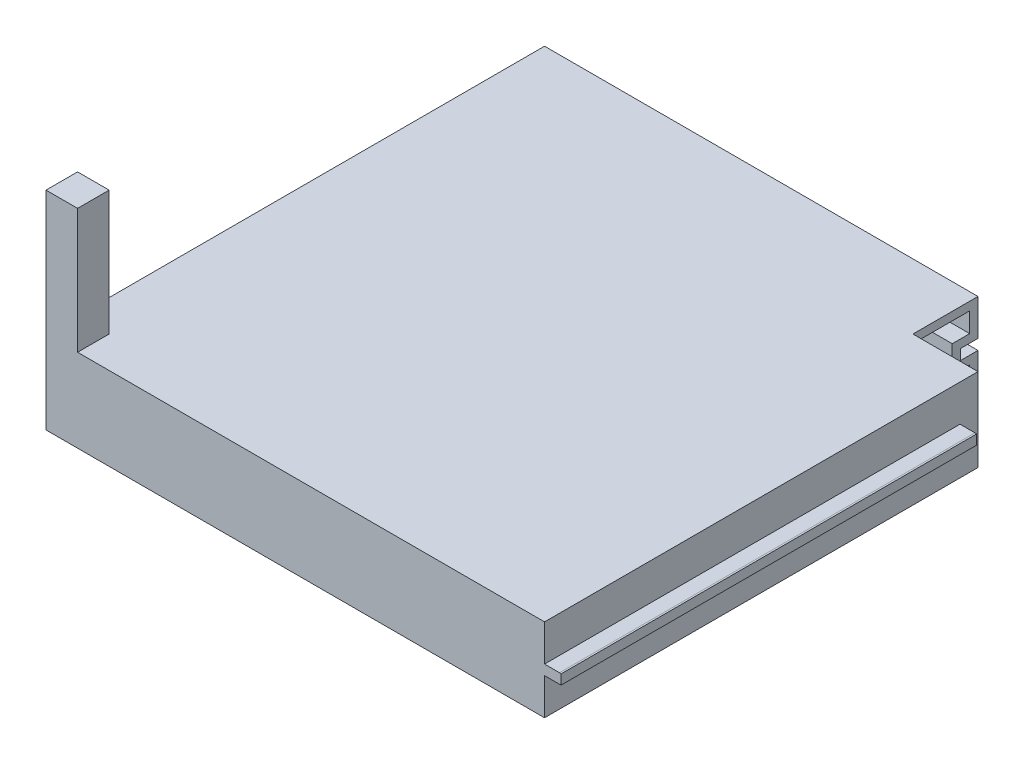
ISO-10303-21;
HEADER;
FILE_DESCRIPTION(('STEP AP214'),'2;1');
FILE_NAME('part.step','',(''),(''),'','','');
FILE_SCHEMA(('AUTOMOTIVE_DESIGN { 1 0 10303 214 1 1 1 1 }'));
ENDSEC;
DATA;
#1=APPLICATION_CONTEXT('core data for automotive mechanical design processes');
#2=APPLICATION_PROTOCOL_DEFINITION('international standard','automotive_design',2000,#1);
#3=PRODUCT_CONTEXT('',#1,'mechanical');
#4=PRODUCT('Part','Part','',(#3));
#5=PRODUCT_RELATED_PRODUCT_CATEGORY('part','',(#4));
#6=PRODUCT_DEFINITION_FORMATION('','',#4);
#7=PRODUCT_DEFINITION_CONTEXT('part definition',#1,'design');
#8=PRODUCT_DEFINITION('design','',#6,#7);
#9=PRODUCT_DEFINITION_SHAPE('','',#8);
#10=(LENGTH_UNIT() NAMED_UNIT(*) SI_UNIT(.MILLI.,.METRE.));
#11=(NAMED_UNIT(*) PLANE_ANGLE_UNIT() SI_UNIT($,.RADIAN.));
#12=(NAMED_UNIT(*) SI_UNIT($,.STERADIAN.) SOLID_ANGLE_UNIT());
#13=UNCERTAINTY_MEASURE_WITH_UNIT(LENGTH_MEASURE(1.E-05),#10,'distance_accuracy_value','');
#14=(GEOMETRIC_REPRESENTATION_CONTEXT(3) GLOBAL_UNCERTAINTY_ASSIGNED_CONTEXT((#13)) GLOBAL_UNIT_ASSIGNED_CONTEXT((#10,
#11,#12)) REPRESENTATION_CONTEXT('',''));
#15=CARTESIAN_POINT('',(0.,0.,0.));
#16=DIRECTION('',(0.,0.,1.));
#17=DIRECTION('',(1.,0.,0.));
#18=AXIS2_PLACEMENT_3D('',#15,#16,#17);
#19=CARTESIAN_POINT('',(-22.3212121212121,25.4,-15.875));
#20=DIRECTION('',(0.,0.,1.));
#21=DIRECTION('',(1.,0.,0.));
#22=AXIS2_PLACEMENT_3D('',#19,#20,#21);
#23=PLANE('',#22);
#24=DIRECTION('',(-1.,0.,0.));
#25=VECTOR('',#24,1.);
#26=CARTESIAN_POINT('',(-22.3212121212121,25.4,-15.875));
#27=LINE('',#26,#25);
#28=CARTESIAN_POINT('',(110.178787878788,25.4,-15.875));
#29=VERTEX_POINT('',#28);
#30=CARTESIAN_POINT('',(-22.3212121212121,25.4,-15.875));
#31=VERTEX_POINT('',#30);
#32=EDGE_CURVE('E292',#29,#31,#27,.T.);
#33=ORIENTED_EDGE('',*,*,#32,.F.);
#34=DIRECTION('',(0.,-1.,0.));
#35=VECTOR('',#34,1.);
#36=CARTESIAN_POINT('',(110.178787878788,25.4,-15.875));
#37=LINE('',#36,#35);
#38=CARTESIAN_POINT('',(110.178787878788,14.2875,-15.875));
#39=VERTEX_POINT('',#38);
#40=EDGE_CURVE('E755',#29,#39,#37,.T.);
#41=ORIENTED_EDGE('',*,*,#40,.T.);
#42=DIRECTION('',(-1.,0.,0.));
#43=VECTOR('',#42,1.);
#44=CARTESIAN_POINT('',(127.538787878788,14.2875,-15.875));
#45=LINE('',#44,#43);
#46=CARTESIAN_POINT('',(-22.3212121212121,14.2875,-15.875));
#47=VERTEX_POINT('',#46);
#48=EDGE_CURVE('E585',#39,#47,#45,.T.);
#49=ORIENTED_EDGE('',*,*,#48,.T.);
#50=DIRECTION('',(0.,-1.,0.));
#51=VECTOR('',#50,1.);
#52=CARTESIAN_POINT('',(-22.3212121212121,25.4,-15.875));
#53=LINE('',#52,#51);
#54=EDGE_CURVE('E316',#31,#47,#53,.T.);
#55=ORIENTED_EDGE('',*,*,#54,.F.);
#56=EDGE_LOOP('',(#33,#41,#49,#55));
#57=FACE_BOUND('',#56,.T.);
#58=ADVANCED_FACE('F47',(#57),#23,.F.);
#59=CARTESIAN_POINT('',(130.078787878788,25.4,-15.875));
#60=DIRECTION('',(-1.,0.,0.));
#61=DIRECTION('',(0.,0.,1.));
#62=AXIS2_PLACEMENT_3D('',#59,#60,#61);
#63=PLANE('',#62);
#64=DIRECTION('',(0.,0.,-1.));
#65=VECTOR('',#64,1.);
#66=CARTESIAN_POINT('',(130.078787878788,0.,-15.875));
#67=LINE('',#66,#65);
#68=CARTESIAN_POINT('',(130.078787878788,0.,136.525));
#69=VERTEX_POINT('',#68);
#70=CARTESIAN_POINT('',(130.078787878788,0.,4.02499999999999));
#71=VERTEX_POINT('',#70);
#72=EDGE_CURVE('E283',#69,#71,#67,.T.);
#73=ORIENTED_EDGE('',*,*,#72,.T.);
#74=DIRECTION('',(0.,-1.,0.));
#75=VECTOR('',#74,1.);
#76=CARTESIAN_POINT('',(130.078787878788,25.4,4.02499999999999));
#77=LINE('',#76,#75);
#78=CARTESIAN_POINT('',(130.078787878788,25.4,4.02499999999999));
#79=VERTEX_POINT('',#78);
#80=EDGE_CURVE('E264',#79,#71,#77,.T.);
#81=ORIENTED_EDGE('',*,*,#80,.F.);
#82=DIRECTION('',(0.,0.,-1.));
#83=VECTOR('',#82,1.);
#84=CARTESIAN_POINT('',(130.078787878788,25.4,-15.875));
#85=LINE('',#84,#83);
#86=CARTESIAN_POINT('',(130.078787878788,25.4,136.525));
#87=VERTEX_POINT('',#86);
#88=EDGE_CURVE('E281',#87,#79,#85,.T.);
#89=ORIENTED_EDGE('',*,*,#88,.F.);
#90=DIRECTION('',(0.,-1.,0.));
#91=VECTOR('',#90,1.);
#92=CARTESIAN_POINT('',(130.078787878788,25.4,136.525));
#93=LINE('',#92,#91);
#94=CARTESIAN_POINT('',(130.078787878788,14.224,136.525));
#95=VERTEX_POINT('',#94);
#96=EDGE_CURVE('E321',#87,#95,#93,.T.);
#97=ORIENTED_EDGE('',*,*,#96,.T.);
#98=DIRECTION('',(0.,0.,1.));
#99=VECTOR('',#98,1.);
#100=CARTESIAN_POINT('',(130.078787878788,14.224,9.52500000000001));
#101=LINE('',#100,#99);
#102=CARTESIAN_POINT('',(130.078787878788,14.224,9.52500000000001));
#103=VERTEX_POINT('',#102);
#104=EDGE_CURVE('E617',#103,#95,#101,.T.);
#105=ORIENTED_EDGE('',*,*,#104,.F.);
#106=DIRECTION('',(0.,-1.,0.));
#107=VECTOR('',#106,1.);
#108=CARTESIAN_POINT('',(130.078787878788,14.224,9.52500000000001));
#109=LINE('',#108,#107);
#110=CARTESIAN_POINT('',(130.078787878788,11.176,9.52500000000001));
#111=VERTEX_POINT('',#110);
#112=EDGE_CURVE('E593',#103,#111,#109,.T.);
#113=ORIENTED_EDGE('',*,*,#112,.T.);
#114=DIRECTION('',(0.,0.,1.));
#115=VECTOR('',#114,1.);
#116=CARTESIAN_POINT('',(130.078787878788,11.176,9.52500000000001));
#117=LINE('',#116,#115);
#118=CARTESIAN_POINT('',(130.078787878788,11.176,136.525));
#119=VERTEX_POINT('',#118);
#120=EDGE_CURVE('E608',#111,#119,#117,.T.);
#121=ORIENTED_EDGE('',*,*,#120,.T.);
#122=EDGE_CURVE('E320',#119,#69,#93,.T.);
#123=ORIENTED_EDGE('',*,*,#122,.T.);
#124=EDGE_LOOP('',(#73,#81,#89,#97,#105,#113,#121,#123));
#125=FACE_BOUND('',#124,.T.);
#126=ADVANCED_FACE('F279',(#125),#63,.F.);
#127=CARTESIAN_POINT('',(-22.3212121212121,25.4,-15.875));
#128=DIRECTION('',(1.,0.,0.));
#129=DIRECTION('',(0.,0.,-1.));
#130=AXIS2_PLACEMENT_3D('',#127,#128,#129);
#131=PLANE('',#130);
#132=DIRECTION('',(0.,-1.,0.));
#133=VECTOR('',#132,1.);
#134=CARTESIAN_POINT('',(-22.3212121212121,14.2875,-10.541));
#135=LINE('',#134,#133);
#136=CARTESIAN_POINT('',(-22.3212121212121,14.2875,-10.541));
#137=VERTEX_POINT('',#136);
#138=CARTESIAN_POINT('',(-22.3212121212121,11.1125,-10.541));
#139=VERTEX_POINT('',#138);
#140=EDGE_CURVE('E572',#137,#139,#135,.T.);
#141=ORIENTED_EDGE('',*,*,#140,.T.);
#142=DIRECTION('',(0.,0.,1.));
#143=VECTOR('',#142,1.);
#144=CARTESIAN_POINT('',(-22.3212121212121,11.1125,-15.875));
#145=LINE('',#144,#143);
#146=CARTESIAN_POINT('',(-22.3212121212121,11.1125,-15.875));
#147=VERTEX_POINT('',#146);
#148=EDGE_CURVE('E565',#147,#139,#145,.T.);
#149=ORIENTED_EDGE('',*,*,#148,.F.);
#150=CARTESIAN_POINT('',(-22.3212121212121,0.,-15.875));
#151=VERTEX_POINT('',#150);
#152=EDGE_CURVE('E296',#147,#151,#53,.T.);
#153=ORIENTED_EDGE('',*,*,#152,.T.);
#154=DIRECTION('',(0.,0.,1.));
#155=VECTOR('',#154,1.);
#156=CARTESIAN_POINT('',(-22.3212121212121,0.,-15.875));
#157=LINE('',#156,#155);
#158=CARTESIAN_POINT('',(-22.3212121212121,0.,136.525));
#159=VERTEX_POINT('',#158);
#160=EDGE_CURVE('E302',#151,#159,#157,.T.);
#161=ORIENTED_EDGE('',*,*,#160,.T.);
#162=DIRECTION('',(0.,-1.,0.));
#163=VECTOR('',#162,1.);
#164=CARTESIAN_POINT('',(-22.3212121212121,25.4,136.525));
#165=LINE('',#164,#163);
#166=CARTESIAN_POINT('',(-22.3212121212121,63.5,136.525));
#167=VERTEX_POINT('',#166);
#168=EDGE_CURVE('E324',#167,#159,#165,.T.);
#169=ORIENTED_EDGE('',*,*,#168,.F.);
#170=DIRECTION('',(0.,0.,1.));
#171=VECTOR('',#170,1.);
#172=CARTESIAN_POINT('',(-22.3212121212121,63.5,136.525));
#173=LINE('',#172,#171);
#174=CARTESIAN_POINT('',(-22.3212121212121,63.5,126.873));
#175=VERTEX_POINT('',#174);
#176=EDGE_CURVE('E625',#175,#167,#173,.T.);
#177=ORIENTED_EDGE('',*,*,#176,.F.);
#178=DIRECTION('',(0.,-1.,0.));
#179=VECTOR('',#178,1.);
#180=CARTESIAN_POINT('',(-22.3212121212121,63.5,126.873));
#181=LINE('',#180,#179);
#182=CARTESIAN_POINT('',(-22.3212121212121,25.4,126.873));
#183=VERTEX_POINT('',#182);
#184=EDGE_CURVE('E639',#175,#183,#181,.T.);
#185=ORIENTED_EDGE('',*,*,#184,.T.);
#186=DIRECTION('',(0.,0.,1.));
#187=VECTOR('',#186,1.);
#188=CARTESIAN_POINT('',(-22.3212121212121,25.4,-15.875));
#189=LINE('',#188,#187);
#190=EDGE_CURVE('E298',#31,#183,#189,.T.);
#191=ORIENTED_EDGE('',*,*,#190,.F.);
#192=ORIENTED_EDGE('',*,*,#54,.T.);
#193=DIRECTION('',(0.,0.,1.));
#194=VECTOR('',#193,1.);
#195=CARTESIAN_POINT('',(-22.3212121212121,14.2875,-15.875));
#196=LINE('',#195,#194);
#197=EDGE_CURVE('E576',#47,#137,#196,.T.);
#198=ORIENTED_EDGE('',*,*,#197,.T.);
#199=EDGE_LOOP('',(#141,#149,#153,#161,#169,#177,#185,#191,#192,#198));
#200=FACE_BOUND('',#199,.T.);
#201=ADVANCED_FACE('F666',(#200),#131,.F.);
#202=CARTESIAN_POINT('',(-22.3212121212121,25.4,136.525));
#203=DIRECTION('',(0.,0.,-1.));
#204=DIRECTION('',(-1.,0.,0.));
#205=AXIS2_PLACEMENT_3D('',#202,#203,#204);
#206=PLANE('',#205);
#207=DIRECTION('',(1.,0.,0.));
#208=VECTOR('',#207,1.);
#209=CARTESIAN_POINT('',(130.078787878788,11.176,136.525));
#210=LINE('',#209,#208);
#211=CARTESIAN_POINT('',(134.650787878788,11.176,136.525));
#212=VERTEX_POINT('',#211);
#213=EDGE_CURVE('E584',#119,#212,#210,.T.);
#214=ORIENTED_EDGE('',*,*,#213,.T.);
#215=DIRECTION('',(-0.997564050259825,-0.0697564737441166,0.));
#216=VECTOR('',#215,1.);
#217=CARTESIAN_POINT('',(134.650787878788,11.176,136.525));
#218=LINE('',#217,#216);
#219=CARTESIAN_POINT('',(135.158787878788,11.2115228204673,136.525));
#220=VERTEX_POINT('',#219);
#221=EDGE_CURVE('E346',#212,#220,#218,.F.);
#222=ORIENTED_EDGE('',*,*,#221,.T.);
#223=DIRECTION('',(0.,1.,0.));
#224=VECTOR('',#223,1.);
#225=CARTESIAN_POINT('',(135.158787878788,14.224,136.525));
#226=LINE('',#225,#224);
#227=CARTESIAN_POINT('',(135.158787878788,14.1884771795327,136.525));
#228=VERTEX_POINT('',#227);
#229=EDGE_CURVE('E612',#220,#228,#226,.T.);
#230=ORIENTED_EDGE('',*,*,#229,.T.);
#231=DIRECTION('',(0.997564050259825,-0.0697564737441166,0.));
#232=VECTOR('',#231,1.);
#233=CARTESIAN_POINT('',(135.158787878788,14.1884771795327,136.525));
#234=LINE('',#233,#232);
#235=CARTESIAN_POINT('',(134.650787878788,14.224,136.525));
#236=VERTEX_POINT('',#235);
#237=EDGE_CURVE('E332',#228,#236,#234,.F.);
#238=ORIENTED_EDGE('',*,*,#237,.T.);
#239=DIRECTION('',(-1.,0.,0.));
#240=VECTOR('',#239,1.);
#241=CARTESIAN_POINT('',(130.078787878788,14.224,136.525));
#242=LINE('',#241,#240);
#243=EDGE_CURVE('E598',#236,#95,#242,.T.);
#244=ORIENTED_EDGE('',*,*,#243,.T.);
#245=ORIENTED_EDGE('',*,*,#96,.F.);
#246=DIRECTION('',(1.,0.,0.));
#247=VECTOR('',#246,1.);
#248=CARTESIAN_POINT('',(-22.3212121212121,25.4,136.525));
#249=LINE('',#248,#247);
#250=CARTESIAN_POINT('',(-12.6692121212121,25.4,136.525));
#251=VERTEX_POINT('',#250);
#252=EDGE_CURVE('E289',#251,#87,#249,.T.);
#253=ORIENTED_EDGE('',*,*,#252,.F.);
#254=DIRECTION('',(0.,-1.,0.));
#255=VECTOR('',#254,1.);
#256=CARTESIAN_POINT('',(-12.6692121212121,63.5,136.525));
#257=LINE('',#256,#255);
#258=CARTESIAN_POINT('',(-12.6692121212121,63.5,136.525));
#259=VERTEX_POINT('',#258);
#260=EDGE_CURVE('E307',#259,#251,#257,.T.);
#261=ORIENTED_EDGE('',*,*,#260,.F.);
#262=DIRECTION('',(1.,0.,0.));
#263=VECTOR('',#262,1.);
#264=CARTESIAN_POINT('',(-22.3212121212121,63.5,136.525));
#265=LINE('',#264,#263);
#266=EDGE_CURVE('E629',#167,#259,#265,.T.);
#267=ORIENTED_EDGE('',*,*,#266,.F.);
#268=ORIENTED_EDGE('',*,*,#168,.T.);
#269=DIRECTION('',(1.,0.,0.));
#270=VECTOR('',#269,1.);
#271=CARTESIAN_POINT('',(-22.3212121212121,0.,136.525));
#272=LINE('',#271,#270);
#273=EDGE_CURVE('E306',#159,#69,#272,.T.);
#274=ORIENTED_EDGE('',*,*,#273,.T.);
#275=ORIENTED_EDGE('',*,*,#122,.F.);
#276=EDGE_LOOP('',(#214,#222,#230,#238,#244,#245,#253,#261,#267,#268,#274,#275));
#277=FACE_BOUND('',#276,.T.);
#278=ADVANCED_FACE('F675',(#277),#206,.F.);
#279=DIRECTION('',(-1.,0.,0.));
#280=VECTOR('',#279,1.);
#281=CARTESIAN_POINT('',(127.538787878788,11.1125,-15.875));
#282=LINE('',#281,#280);
#283=CARTESIAN_POINT('',(110.178787878788,11.1125,-15.875));
#284=VERTEX_POINT('',#283);
#285=EDGE_CURVE('E581',#284,#147,#282,.T.);
#286=ORIENTED_EDGE('',*,*,#285,.F.);
#287=CARTESIAN_POINT('',(110.178787878788,0.,-15.875));
#288=VERTEX_POINT('',#287);
#289=EDGE_CURVE('E737',#284,#288,#37,.T.);
#290=ORIENTED_EDGE('',*,*,#289,.T.);
#291=DIRECTION('',(-1.,0.,0.));
#292=VECTOR('',#291,1.);
#293=CARTESIAN_POINT('',(-22.3212121212121,0.,-15.875));
#294=LINE('',#293,#292);
#295=EDGE_CURVE('E313',#288,#151,#294,.T.);
#296=ORIENTED_EDGE('',*,*,#295,.T.);
#297=ORIENTED_EDGE('',*,*,#152,.F.);
#298=EDGE_LOOP('',(#286,#290,#296,#297));
#299=FACE_BOUND('',#298,.T.);
#300=ADVANCED_FACE('F719',(#299),#23,.F.);
#301=CARTESIAN_POINT('',(0.,25.4,0.));
#302=DIRECTION('',(0.,1.,0.));
#303=DIRECTION('',(0.,0.,1.));
#304=AXIS2_PLACEMENT_3D('',#301,#302,#303);
#305=PLANE('',#304);
#306=DIRECTION('',(0.,0.,-1.));
#307=VECTOR('',#306,1.);
#308=CARTESIAN_POINT('',(110.178787878788,25.4,-15.875));
#309=LINE('',#308,#307);
#310=CARTESIAN_POINT('',(110.178787878788,25.4,4.02499999999999));
#311=VERTEX_POINT('',#310);
#312=EDGE_CURVE('E273',#311,#29,#309,.T.);
#313=ORIENTED_EDGE('',*,*,#312,.T.);
#314=ORIENTED_EDGE('',*,*,#32,.T.);
#315=ORIENTED_EDGE('',*,*,#190,.T.);
#316=DIRECTION('',(-1.,0.,0.));
#317=VECTOR('',#316,1.);
#318=CARTESIAN_POINT('',(-22.3212121212121,25.4,126.873));
#319=LINE('',#318,#317);
#320=CARTESIAN_POINT('',(-12.6692121212121,25.4,126.873));
#321=VERTEX_POINT('',#320);
#322=EDGE_CURVE('E630',#321,#183,#319,.T.);
#323=ORIENTED_EDGE('',*,*,#322,.F.);
#324=DIRECTION('',(0.,0.,-1.));
#325=VECTOR('',#324,1.);
#326=CARTESIAN_POINT('',(-12.6692121212121,25.4,136.525));
#327=LINE('',#326,#325);
#328=EDGE_CURVE('E621',#251,#321,#327,.T.);
#329=ORIENTED_EDGE('',*,*,#328,.F.);
#330=ORIENTED_EDGE('',*,*,#252,.T.);
#331=ORIENTED_EDGE('',*,*,#88,.T.);
#332=DIRECTION('',(-1.,0.,0.));
#333=VECTOR('',#332,1.);
#334=CARTESIAN_POINT('',(130.078787878788,25.4,4.02499999999999));
#335=LINE('',#334,#333);
#336=EDGE_CURVE('E260',#79,#311,#335,.T.);
#337=ORIENTED_EDGE('',*,*,#336,.T.);
#338=EDGE_LOOP('',(#313,#314,#315,#323,#329,#330,#331,#337));
#339=FACE_BOUND('',#338,.T.);
#340=ADVANCED_FACE('F287',(#339),#305,.T.);
#341=CARTESIAN_POINT('',(0.,0.,0.));
#342=DIRECTION('',(0.,1.,0.));
#343=DIRECTION('',(0.,0.,1.));
#344=AXIS2_PLACEMENT_3D('',#341,#342,#343);
#345=PLANE('',#344);
#346=CARTESIAN_POINT('',(104.578787878788,0.,9.62499999999999));
#347=DIRECTION('',(0.,1.,0.));
#348=DIRECTION('',(0.,0.,1.));
#349=AXIS2_PLACEMENT_3D('',#346,#347,#348);
#350=CIRCLE('',#349,4.445);
#351=CARTESIAN_POINT('',(104.578787878788,0.,14.07));
#352=VERTEX_POINT('',#351);
#353=EDGE_CURVE('E560',#352,#352,#350,.T.);
#354=ORIENTED_EDGE('',*,*,#353,.T.);
#355=EDGE_LOOP('',(#354));
#356=FACE_BOUND('',#355,.T.);
#357=ORIENTED_EDGE('',*,*,#295,.F.);
#358=DIRECTION('',(0.,0.,-1.));
#359=VECTOR('',#358,1.);
#360=CARTESIAN_POINT('',(110.178787878788,0.,-15.875));
#361=LINE('',#360,#359);
#362=CARTESIAN_POINT('',(110.178787878788,0.,4.02499999999999));
#363=VERTEX_POINT('',#362);
#364=EDGE_CURVE('E274',#363,#288,#361,.T.);
#365=ORIENTED_EDGE('',*,*,#364,.F.);
#366=DIRECTION('',(-1.,0.,0.));
#367=VECTOR('',#366,1.);
#368=CARTESIAN_POINT('',(130.078787878788,0.,4.02499999999999));
#369=LINE('',#368,#367);
#370=EDGE_CURVE('E767',#71,#363,#369,.T.);
#371=ORIENTED_EDGE('',*,*,#370,.F.);
#372=ORIENTED_EDGE('',*,*,#72,.F.);
#373=ORIENTED_EDGE('',*,*,#273,.F.);
#374=ORIENTED_EDGE('',*,*,#160,.F.);
#375=EDGE_LOOP('',(#357,#365,#371,#372,#373,#374));
#376=FACE_BOUND('',#375,.T.);
#377=ADVANCED_FACE('F731',(#356,#376),#345,.F.);
#378=CARTESIAN_POINT('',(-12.6692121212121,63.5,136.525));
#379=DIRECTION('',(-1.,0.,0.));
#380=DIRECTION('',(0.,0.,1.));
#381=AXIS2_PLACEMENT_3D('',#378,#379,#380);
#382=PLANE('',#381);
#383=ORIENTED_EDGE('',*,*,#328,.T.);
#384=DIRECTION('',(0.,-1.,0.));
#385=VECTOR('',#384,1.);
#386=CARTESIAN_POINT('',(-12.6692121212121,63.5,126.873));
#387=LINE('',#386,#385);
#388=CARTESIAN_POINT('',(-12.6692121212121,63.5,126.873));
#389=VERTEX_POINT('',#388);
#390=EDGE_CURVE('E649',#389,#321,#387,.T.);
#391=ORIENTED_EDGE('',*,*,#390,.F.);
#392=DIRECTION('',(0.,0.,-1.));
#393=VECTOR('',#392,1.);
#394=CARTESIAN_POINT('',(-12.6692121212121,63.5,136.525));
#395=LINE('',#394,#393);
#396=EDGE_CURVE('E633',#259,#389,#395,.T.);
#397=ORIENTED_EDGE('',*,*,#396,.F.);
#398=ORIENTED_EDGE('',*,*,#260,.T.);
#399=EDGE_LOOP('',(#383,#391,#397,#398));
#400=FACE_BOUND('',#399,.T.);
#401=ADVANCED_FACE('F673',(#400),#382,.F.);
#402=CARTESIAN_POINT('',(-22.3212121212121,63.5,126.873));
#403=DIRECTION('',(0.,0.,1.));
#404=DIRECTION('',(1.,0.,0.));
#405=AXIS2_PLACEMENT_3D('',#402,#403,#404);
#406=PLANE('',#405);
#407=ORIENTED_EDGE('',*,*,#322,.T.);
#408=ORIENTED_EDGE('',*,*,#184,.F.);
#409=DIRECTION('',(-1.,0.,0.));
#410=VECTOR('',#409,1.);
#411=CARTESIAN_POINT('',(-22.3212121212121,63.5,126.873));
#412=LINE('',#411,#410);
#413=EDGE_CURVE('E636',#389,#175,#412,.T.);
#414=ORIENTED_EDGE('',*,*,#413,.F.);
#415=ORIENTED_EDGE('',*,*,#390,.T.);
#416=EDGE_LOOP('',(#407,#408,#414,#415));
#417=FACE_BOUND('',#416,.T.);
#418=ADVANCED_FACE('F662',(#417),#406,.F.);
#419=CARTESIAN_POINT('',(0.,63.5,0.));
#420=DIRECTION('',(0.,-1.,0.));
#421=DIRECTION('',(0.,0.,-1.));
#422=AXIS2_PLACEMENT_3D('',#419,#420,#421);
#423=PLANE('',#422);
#424=ORIENTED_EDGE('',*,*,#176,.T.);
#425=ORIENTED_EDGE('',*,*,#266,.T.);
#426=ORIENTED_EDGE('',*,*,#396,.T.);
#427=ORIENTED_EDGE('',*,*,#413,.T.);
#428=EDGE_LOOP('',(#424,#425,#426,#427));
#429=FACE_BOUND('',#428,.T.);
#430=ADVANCED_FACE('F669',(#429),#423,.F.);
#431=CARTESIAN_POINT('',(130.078787878788,14.224,9.52500000000001));
#432=DIRECTION('',(0.,1.,0.));
#433=DIRECTION('',(0.,0.,1.));
#434=AXIS2_PLACEMENT_3D('',#431,#432,#433);
#435=PLANE('',#434);
#436=ORIENTED_EDGE('',*,*,#243,.F.);
#437=DIRECTION('',(0.,0.,-1.));
#438=VECTOR('',#437,1.);
#439=CARTESIAN_POINT('',(134.650787878788,14.224,9.52500000000001));
#440=LINE('',#439,#438);
#441=CARTESIAN_POINT('',(134.650787878788,14.224,9.52500000000001));
#442=VERTEX_POINT('',#441);
#443=EDGE_CURVE('E335',#236,#442,#440,.T.);
#444=ORIENTED_EDGE('',*,*,#443,.T.);
#445=DIRECTION('',(-1.,0.,0.));
#446=VECTOR('',#445,1.);
#447=CARTESIAN_POINT('',(130.078787878788,14.224,9.52500000000001));
#448=LINE('',#447,#446);
#449=EDGE_CURVE('E605',#442,#103,#448,.T.);
#450=ORIENTED_EDGE('',*,*,#449,.T.);
#451=ORIENTED_EDGE('',*,*,#104,.T.);
#452=EDGE_LOOP('',(#436,#444,#450,#451));
#453=FACE_BOUND('',#452,.T.);
#454=ADVANCED_FACE('F680',(#453),#435,.T.);
#455=CARTESIAN_POINT('',(135.158787878788,14.224,9.52500000000001));
#456=DIRECTION('',(1.,0.,0.));
#457=DIRECTION('',(0.,0.,-1.));
#458=AXIS2_PLACEMENT_3D('',#455,#456,#457);
#459=PLANE('',#458);
#460=ORIENTED_EDGE('',*,*,#229,.F.);
#461=DIRECTION('',(0.,0.,-1.));
#462=VECTOR('',#461,1.);
#463=CARTESIAN_POINT('',(135.158787878788,11.2115228204673,9.52500000000001));
#464=LINE('',#463,#462);
#465=CARTESIAN_POINT('',(135.158787878788,11.2115228204673,9.52500000000001));
#466=VERTEX_POINT('',#465);
#467=EDGE_CURVE('E349',#220,#466,#464,.T.);
#468=ORIENTED_EDGE('',*,*,#467,.T.);
#469=DIRECTION('',(0.,1.,0.));
#470=VECTOR('',#469,1.);
#471=CARTESIAN_POINT('',(135.158787878788,14.224,9.52500000000001));
#472=LINE('',#471,#470);
#473=CARTESIAN_POINT('',(135.158787878788,14.1884771795327,9.52500000000001));
#474=VERTEX_POINT('',#473);
#475=EDGE_CURVE('E602',#466,#474,#472,.T.);
#476=ORIENTED_EDGE('',*,*,#475,.T.);
#477=DIRECTION('',(0.,0.,1.));
#478=VECTOR('',#477,1.);
#479=CARTESIAN_POINT('',(135.158787878788,14.1884771795327,9.52500000000001));
#480=LINE('',#479,#478);
#481=EDGE_CURVE('E328',#474,#228,#480,.T.);
#482=ORIENTED_EDGE('',*,*,#481,.T.);
#483=EDGE_LOOP('',(#460,#468,#476,#482));
#484=FACE_BOUND('',#483,.T.);
#485=ADVANCED_FACE('F699',(#484),#459,.T.);
#486=CARTESIAN_POINT('',(130.078787878788,11.176,9.52500000000001));
#487=DIRECTION('',(0.,-1.,0.));
#488=DIRECTION('',(0.,0.,-1.));
#489=AXIS2_PLACEMENT_3D('',#486,#487,#488);
#490=PLANE('',#489);
#491=DIRECTION('',(1.,0.,0.));
#492=VECTOR('',#491,1.);
#493=CARTESIAN_POINT('',(130.078787878788,11.176,9.52500000000001));
#494=LINE('',#493,#492);
#495=CARTESIAN_POINT('',(134.650787878788,11.176,9.52500000000001));
#496=VERTEX_POINT('',#495);
#497=EDGE_CURVE('E597',#111,#496,#494,.T.);
#498=ORIENTED_EDGE('',*,*,#497,.T.);
#499=DIRECTION('',(0.,0.,1.));
#500=VECTOR('',#499,1.);
#501=CARTESIAN_POINT('',(134.650787878788,11.176,9.52500000000001));
#502=LINE('',#501,#500);
#503=EDGE_CURVE('E342',#496,#212,#502,.T.);
#504=ORIENTED_EDGE('',*,*,#503,.T.);
#505=ORIENTED_EDGE('',*,*,#213,.F.);
#506=ORIENTED_EDGE('',*,*,#120,.F.);
#507=EDGE_LOOP('',(#498,#504,#505,#506));
#508=FACE_BOUND('',#507,.T.);
#509=ADVANCED_FACE('F691',(#508),#490,.T.);
#510=CARTESIAN_POINT('',(0.,0.,9.52500000000001));
#511=DIRECTION('',(0.,0.,1.));
#512=DIRECTION('',(1.,0.,0.));
#513=AXIS2_PLACEMENT_3D('',#510,#511,#512);
#514=PLANE('',#513);
#515=ORIENTED_EDGE('',*,*,#475,.F.);
#516=DIRECTION('',(0.997564050259825,0.0697564737441166,0.));
#517=VECTOR('',#516,1.);
#518=CARTESIAN_POINT('',(134.650787878788,11.176,9.52500000000001));
#519=LINE('',#518,#517);
#520=EDGE_CURVE('E352',#466,#496,#519,.F.);
#521=ORIENTED_EDGE('',*,*,#520,.T.);
#522=ORIENTED_EDGE('',*,*,#497,.F.);
#523=ORIENTED_EDGE('',*,*,#112,.F.);
#524=ORIENTED_EDGE('',*,*,#449,.F.);
#525=DIRECTION('',(-0.997564050259825,0.0697564737441166,0.));
#526=VECTOR('',#525,1.);
#527=CARTESIAN_POINT('',(135.158787878788,14.1884771795327,9.52500000000001));
#528=LINE('',#527,#526);
#529=EDGE_CURVE('E338',#442,#474,#528,.F.);
#530=ORIENTED_EDGE('',*,*,#529,.T.);
#531=EDGE_LOOP('',(#515,#521,#522,#523,#524,#530));
#532=FACE_BOUND('',#531,.T.);
#533=ADVANCED_FACE('F687',(#532),#514,.F.);
#534=CARTESIAN_POINT('',(135.158787878788,14.1884771795327,9.52500000000001));
#535=DIRECTION('',(-0.0697564737441166,-0.997564050259825,0.));
#536=DIRECTION('',(0.,0.,1.));
#537=AXIS2_PLACEMENT_3D('',#534,#535,#536);
#538=PLANE('',#537);
#539=ORIENTED_EDGE('',*,*,#529,.F.);
#540=ORIENTED_EDGE('',*,*,#443,.F.);
#541=ORIENTED_EDGE('',*,*,#237,.F.);
#542=ORIENTED_EDGE('',*,*,#481,.F.);
#543=EDGE_LOOP('',(#539,#540,#541,#542));
#544=FACE_BOUND('',#543,.T.);
#545=ADVANCED_FACE('F702',(#544),#538,.F.);
#546=CARTESIAN_POINT('',(134.650787878788,11.176,9.52500000000001));
#547=DIRECTION('',(-0.0697564737441166,0.997564050259825,0.));
#548=DIRECTION('',(0.,0.,1.));
#549=AXIS2_PLACEMENT_3D('',#546,#547,#548);
#550=PLANE('',#549);
#551=ORIENTED_EDGE('',*,*,#520,.F.);
#552=ORIENTED_EDGE('',*,*,#467,.F.);
#553=ORIENTED_EDGE('',*,*,#221,.F.);
#554=ORIENTED_EDGE('',*,*,#503,.F.);
#555=EDGE_LOOP('',(#551,#552,#553,#554));
#556=FACE_BOUND('',#555,.T.);
#557=ADVANCED_FACE('F693',(#556),#550,.F.);
#558=CARTESIAN_POINT('',(127.538787878788,11.1125,-15.875));
#559=DIRECTION('',(0.,-1.,0.));
#560=DIRECTION('',(0.,0.,-1.));
#561=AXIS2_PLACEMENT_3D('',#558,#559,#560);
#562=PLANE('',#561);
#563=DIRECTION('',(-1.,0.,0.));
#564=VECTOR('',#563,1.);
#565=CARTESIAN_POINT('',(127.538787878788,11.1125,-10.541));
#566=LINE('',#565,#564);
#567=CARTESIAN_POINT('',(110.178787878788,11.1125,-10.541));
#568=VERTEX_POINT('',#567);
#569=EDGE_CURVE('E580',#568,#139,#566,.T.);
#570=ORIENTED_EDGE('',*,*,#569,.F.);
#571=DIRECTION('',(0.,0.,-1.));
#572=VECTOR('',#571,1.);
#573=CARTESIAN_POINT('',(110.178787878788,11.1125,-15.875));
#574=LINE('',#573,#572);
#575=EDGE_CURVE('E63',#568,#284,#574,.T.);
#576=ORIENTED_EDGE('',*,*,#575,.T.);
#577=ORIENTED_EDGE('',*,*,#285,.T.);
#578=ORIENTED_EDGE('',*,*,#148,.T.);
#579=EDGE_LOOP('',(#570,#576,#577,#578));
#580=FACE_BOUND('',#579,.T.);
#581=ADVANCED_FACE('F710',(#580),#562,.F.);
#582=CARTESIAN_POINT('',(127.538787878788,14.2875,-15.875));
#583=DIRECTION('',(0.,-1.,0.));
#584=DIRECTION('',(0.,0.,-1.));
#585=AXIS2_PLACEMENT_3D('',#582,#583,#584);
#586=PLANE('',#585);
#587=DIRECTION('',(0.,0.,-1.));
#588=VECTOR('',#587,1.);
#589=CARTESIAN_POINT('',(110.178787878788,14.2875,-15.875));
#590=LINE('',#589,#588);
#591=CARTESIAN_POINT('',(110.178787878788,14.2875,-10.541));
#592=VERTEX_POINT('',#591);
#593=EDGE_CURVE('E542',#592,#39,#590,.T.);
#594=ORIENTED_EDGE('',*,*,#593,.F.);
#595=DIRECTION('',(-1.,0.,0.));
#596=VECTOR('',#595,1.);
#597=CARTESIAN_POINT('',(127.538787878788,14.2875,-10.541));
#598=LINE('',#597,#596);
#599=EDGE_CURVE('E588',#592,#137,#598,.T.);
#600=ORIENTED_EDGE('',*,*,#599,.T.);
#601=ORIENTED_EDGE('',*,*,#197,.F.);
#602=ORIENTED_EDGE('',*,*,#48,.F.);
#603=EDGE_LOOP('',(#594,#600,#601,#602));
#604=FACE_BOUND('',#603,.T.);
#605=ADVANCED_FACE('F754',(#604),#586,.T.);
#606=CARTESIAN_POINT('',(127.538787878788,14.2875,-10.541));
#607=DIRECTION('',(0.,0.,-1.));
#608=DIRECTION('',(-1.,0.,0.));
#609=AXIS2_PLACEMENT_3D('',#606,#607,#608);
#610=PLANE('',#609);
#611=DIRECTION('',(0.,1.,0.));
#612=VECTOR('',#611,1.);
#613=CARTESIAN_POINT('',(110.178787878788,14.2875,-10.541));
#614=LINE('',#613,#612);
#615=EDGE_CURVE('E539',#568,#592,#614,.T.);
#616=ORIENTED_EDGE('',*,*,#615,.F.);
#617=ORIENTED_EDGE('',*,*,#569,.T.);
#618=ORIENTED_EDGE('',*,*,#140,.F.);
#619=ORIENTED_EDGE('',*,*,#599,.F.);
#620=EDGE_LOOP('',(#616,#617,#618,#619));
#621=FACE_BOUND('',#620,.T.);
#622=ADVANCED_FACE('F748',(#621),#610,.T.);
#623=CARTESIAN_POINT('',(104.578787878788,-15.,9.62499999999999));
#624=DIRECTION('',(0.,1.,0.));
#625=DIRECTION('',(0.,0.,1.));
#626=AXIS2_PLACEMENT_3D('',#623,#624,#625);
#627=CYLINDRICAL_SURFACE('',#626,4.445);
#628=CARTESIAN_POINT('',(104.578787878788,-15.,9.62499999999999));
#629=DIRECTION('',(0.,1.,0.));
#630=DIRECTION('',(0.,0.,1.));
#631=AXIS2_PLACEMENT_3D('',#628,#629,#630);
#632=CIRCLE('',#631,4.445);
#633=CARTESIAN_POINT('',(104.578787878788,-15.,14.07));
#634=VERTEX_POINT('',#633);
#635=EDGE_CURVE('E561',#634,#634,#632,.T.);
#636=ORIENTED_EDGE('',*,*,#635,.T.);
#637=EDGE_LOOP('',(#636));
#638=FACE_BOUND('',#637,.T.);
#639=ORIENTED_EDGE('',*,*,#353,.F.);
#640=EDGE_LOOP('',(#639));
#641=FACE_BOUND('',#640,.T.);
#642=ADVANCED_FACE('F795',(#638,#641),#627,.T.);
#643=CARTESIAN_POINT('',(104.578787878788,-15.,9.62499999999999));
#644=DIRECTION('',(0.,1.,0.));
#645=DIRECTION('',(0.,0.,1.));
#646=AXIS2_PLACEMENT_3D('',#643,#644,#645);
#647=PLANE('',#646);
#648=CARTESIAN_POINT('',(104.578787878788,-15.,9.62499999999999));
#649=DIRECTION('',(0.,-1.,0.));
#650=DIRECTION('',(0.,0.,-1.));
#651=AXIS2_PLACEMENT_3D('',#648,#649,#650);
#652=CIRCLE('',#651,1.);
#653=CARTESIAN_POINT('',(104.578787878788,-15.,8.62499999999999));
#654=VERTEX_POINT('',#653);
#655=EDGE_CURVE('E552',#654,#654,#652,.T.);
#656=ORIENTED_EDGE('',*,*,#655,.F.);
#657=EDGE_LOOP('',(#656));
#658=FACE_BOUND('',#657,.T.);
#659=ORIENTED_EDGE('',*,*,#635,.F.);
#660=EDGE_LOOP('',(#659));
#661=FACE_BOUND('',#660,.T.);
#662=ADVANCED_FACE('F800',(#658,#661),#647,.F.);
#663=CARTESIAN_POINT('',(104.578787878788,-10.428,9.62499999999999));
#664=DIRECTION('',(0.,-1.,0.));
#665=DIRECTION('',(0.,0.,-1.));
#666=AXIS2_PLACEMENT_3D('',#663,#664,#665);
#667=CONICAL_SURFACE('',#666,1.,1.02974425867666);
#668=CARTESIAN_POINT('',(104.578787878788,-9.82713938097244,9.62499999999999));
#669=VERTEX_POINT('',#668);
#670=VERTEX_LOOP('',#669);
#671=FACE_BOUND('',#670,.T.);
#672=CARTESIAN_POINT('',(104.578787878788,-10.428,9.62499999999999));
#673=DIRECTION('',(0.,-1.,0.));
#674=DIRECTION('',(0.,0.,-1.));
#675=AXIS2_PLACEMENT_3D('',#672,#673,#674);
#676=CIRCLE('',#675,1.);
#677=CARTESIAN_POINT('',(104.578787878788,-10.428,8.62499999999999));
#678=VERTEX_POINT('',#677);
#679=EDGE_CURVE('E556',#678,#678,#676,.T.);
#680=ORIENTED_EDGE('',*,*,#679,.T.);
#681=EDGE_LOOP('',(#680));
#682=FACE_BOUND('',#681,.T.);
#683=ADVANCED_FACE('F804',(#671,#682),#667,.F.);
#684=CARTESIAN_POINT('',(104.578787878788,-15.,9.62499999999999));
#685=DIRECTION('',(0.,-1.,0.));
#686=DIRECTION('',(0.,0.,-1.));
#687=AXIS2_PLACEMENT_3D('',#684,#685,#686);
#688=CYLINDRICAL_SURFACE('',#687,1.);
#689=ORIENTED_EDGE('',*,*,#679,.F.);
#690=EDGE_LOOP('',(#689));
#691=FACE_BOUND('',#690,.T.);
#692=ORIENTED_EDGE('',*,*,#655,.T.);
#693=EDGE_LOOP('',(#692));
#694=FACE_BOUND('',#693,.T.);
#695=ADVANCED_FACE('F808',(#691,#694),#688,.F.);
#696=CARTESIAN_POINT('',(130.078787878788,25.4,4.02499999999999));
#697=DIRECTION('',(0.,0.,1.));
#698=DIRECTION('',(1.,0.,0.));
#699=AXIS2_PLACEMENT_3D('',#696,#697,#698);
#700=PLANE('',#699);
#701=DIRECTION('',(0.,-1.,0.));
#702=VECTOR('',#701,1.);
#703=CARTESIAN_POINT('',(110.178787878788,25.4,4.02499999999999));
#704=LINE('',#703,#702);
#705=CARTESIAN_POINT('',(110.178787878788,22.86,4.02499999999999));
#706=VERTEX_POINT('',#705);
#707=EDGE_CURVE('E267',#311,#706,#704,.T.);
#708=ORIENTED_EDGE('',*,*,#707,.F.);
#709=ORIENTED_EDGE('',*,*,#336,.F.);
#710=ORIENTED_EDGE('',*,*,#80,.T.);
#711=ORIENTED_EDGE('',*,*,#370,.T.);
#712=CARTESIAN_POINT('',(110.178787878788,2.54,4.02499999999999));
#713=VERTEX_POINT('',#712);
#714=EDGE_CURVE('E285',#713,#363,#704,.T.);
#715=ORIENTED_EDGE('',*,*,#714,.F.);
#716=DIRECTION('',(1.,0.,0.));
#717=VECTOR('',#716,1.);
#718=CARTESIAN_POINT('',(0.,2.54,4.02499999999997));
#719=LINE('',#718,#717);
#720=CARTESIAN_POINT('',(127.538787878788,2.54,4.02499999999999));
#721=VERTEX_POINT('',#720);
#722=EDGE_CURVE('E11',#713,#721,#719,.T.);
#723=ORIENTED_EDGE('',*,*,#722,.T.);
#724=DIRECTION('',(0.,1.,0.));
#725=VECTOR('',#724,1.);
#726=CARTESIAN_POINT('',(127.538787878788,25.4,4.02499999999999));
#727=LINE('',#726,#725);
#728=CARTESIAN_POINT('',(127.538787878788,22.86,4.02499999999999));
#729=VERTEX_POINT('',#728);
#730=EDGE_CURVE('E508',#721,#729,#727,.T.);
#731=ORIENTED_EDGE('',*,*,#730,.T.);
#732=DIRECTION('',(1.,0.,0.));
#733=VECTOR('',#732,1.);
#734=CARTESIAN_POINT('',(0.,22.86,4.02499999999997));
#735=LINE('',#734,#733);
#736=EDGE_CURVE('E549',#706,#729,#735,.T.);
#737=ORIENTED_EDGE('',*,*,#736,.F.);
#738=EDGE_LOOP('',(#708,#709,#710,#711,#715,#723,#731,#737));
#739=FACE_BOUND('',#738,.T.);
#740=ADVANCED_FACE('F262',(#739),#700,.F.);
#741=CARTESIAN_POINT('',(110.178787878788,25.4,-15.875));
#742=DIRECTION('',(-1.,0.,0.));
#743=DIRECTION('',(0.,0.,1.));
#744=AXIS2_PLACEMENT_3D('',#741,#742,#743);
#745=PLANE('',#744);
#746=ORIENTED_EDGE('',*,*,#615,.T.);
#747=ORIENTED_EDGE('',*,*,#593,.T.);
#748=ORIENTED_EDGE('',*,*,#40,.F.);
#749=ORIENTED_EDGE('',*,*,#312,.F.);
#750=ORIENTED_EDGE('',*,*,#707,.T.);
#751=DIRECTION('',(0.,0.,1.));
#752=VECTOR('',#751,1.);
#753=CARTESIAN_POINT('',(110.178787878788,22.86,-1.5367214463357E-13));
#754=LINE('',#753,#752);
#755=CARTESIAN_POINT('',(110.178787878788,22.86,-13.335));
#756=VERTEX_POINT('',#755);
#757=EDGE_CURVE('E486',#756,#706,#754,.T.);
#758=ORIENTED_EDGE('',*,*,#757,.F.);
#759=DIRECTION('',(0.,-1.,0.));
#760=VECTOR('',#759,1.);
#761=CARTESIAN_POINT('',(110.178787878788,25.4,-13.335));
#762=LINE('',#761,#760);
#763=CARTESIAN_POINT('',(110.178787878788,16.8275,-13.335));
#764=VERTEX_POINT('',#763);
#765=EDGE_CURVE('E481',#756,#764,#762,.T.);
#766=ORIENTED_EDGE('',*,*,#765,.T.);
#767=DIRECTION('',(0.,0.,-1.));
#768=VECTOR('',#767,1.);
#769=CARTESIAN_POINT('',(110.178787878788,16.8275,-15.875));
#770=LINE('',#769,#768);
#771=CARTESIAN_POINT('',(110.178787878788,16.8275,-8.00100000000001));
#772=VERTEX_POINT('',#771);
#773=EDGE_CURVE('E70',#772,#764,#770,.T.);
#774=ORIENTED_EDGE('',*,*,#773,.F.);
#775=DIRECTION('',(0.,1.,0.));
#776=VECTOR('',#775,1.);
#777=CARTESIAN_POINT('',(110.178787878788,14.2875,-8.00100000000001));
#778=LINE('',#777,#776);
#779=CARTESIAN_POINT('',(110.178787878788,8.5725,-8.00100000000001));
#780=VERTEX_POINT('',#779);
#781=EDGE_CURVE('E56',#780,#772,#778,.T.);
#782=ORIENTED_EDGE('',*,*,#781,.F.);
#783=DIRECTION('',(0.,0.,-1.));
#784=VECTOR('',#783,1.);
#785=CARTESIAN_POINT('',(110.178787878788,8.5725,-15.875));
#786=LINE('',#785,#784);
#787=CARTESIAN_POINT('',(110.178787878788,8.5725,-13.335));
#788=VERTEX_POINT('',#787);
#789=EDGE_CURVE('E525',#780,#788,#786,.T.);
#790=ORIENTED_EDGE('',*,*,#789,.T.);
#791=DIRECTION('',(0.,-1.,0.));
#792=VECTOR('',#791,1.);
#793=CARTESIAN_POINT('',(110.178787878788,25.4,-13.335));
#794=LINE('',#793,#792);
#795=CARTESIAN_POINT('',(110.178787878788,2.54,-13.335));
#796=VERTEX_POINT('',#795);
#797=EDGE_CURVE('E522',#788,#796,#794,.T.);
#798=ORIENTED_EDGE('',*,*,#797,.T.);
#799=DIRECTION('',(0.,0.,1.));
#800=VECTOR('',#799,1.);
#801=CARTESIAN_POINT('',(110.178787878788,2.54,-1.5367214463357E-13));
#802=LINE('',#801,#800);
#803=EDGE_CURVE('E536',#796,#713,#802,.T.);
#804=ORIENTED_EDGE('',*,*,#803,.T.);
#805=ORIENTED_EDGE('',*,*,#714,.T.);
#806=ORIENTED_EDGE('',*,*,#364,.T.);
#807=ORIENTED_EDGE('',*,*,#289,.F.);
#808=ORIENTED_EDGE('',*,*,#575,.F.);
#809=EDGE_LOOP('',(#746,#747,#748,#749,#750,#758,#766,#774,#782,#790,#798,#804,#805,#806,#807,#808));
#810=FACE_BOUND('',#809,.T.);
#811=ADVANCED_FACE('F750',(#810),#745,.F.);
#812=CARTESIAN_POINT('',(104.578787878788,-15.,9.62499999999999));
#813=DIRECTION('',(0.,1.,0.));
#814=DIRECTION('',(0.,0.,1.));
#815=AXIS2_PLACEMENT_3D('',#812,#813,#814);
#816=CYLINDRICAL_SURFACE('',#815,1.905);
#817=CARTESIAN_POINT('',(104.578787878788,2.54,9.62499999999999));
#818=DIRECTION('',(0.,1.,0.));
#819=DIRECTION('',(0.,0.,1.));
#820=AXIS2_PLACEMENT_3D('',#817,#818,#819);
#821=CIRCLE('',#820,1.905);
#822=CARTESIAN_POINT('',(104.578787878788,2.54,11.53));
#823=VERTEX_POINT('',#822);
#824=EDGE_CURVE('E391',#823,#823,#821,.T.);
#825=ORIENTED_EDGE('',*,*,#824,.T.);
#826=EDGE_LOOP('',(#825));
#827=FACE_BOUND('',#826,.T.);
#828=CARTESIAN_POINT('',(104.578787878788,-8.008530031293,9.62499999999999));
#829=DIRECTION('',(0.,-1.,0.));
#830=DIRECTION('',(0.,0.,-1.));
#831=AXIS2_PLACEMENT_3D('',#828,#829,#830);
#832=CIRCLE('',#831,1.905);
#833=CARTESIAN_POINT('',(104.578787878788,-8.008530031293,7.71999999999999));
#834=VERTEX_POINT('',#833);
#835=EDGE_CURVE('E355',#834,#834,#832,.F.);
#836=ORIENTED_EDGE('',*,*,#835,.F.);
#837=EDGE_LOOP('',(#836));
#838=FACE_BOUND('',#837,.T.);
#839=ADVANCED_FACE('F816',(#827,#838),#816,.F.);
#840=CARTESIAN_POINT('',(127.538787878788,25.4,-15.875));
#841=DIRECTION('',(-1.,0.,0.));
#842=DIRECTION('',(0.,0.,1.));
#843=AXIS2_PLACEMENT_3D('',#840,#841,#842);
#844=PLANE('',#843);
#845=ORIENTED_EDGE('',*,*,#730,.F.);
#846=DIRECTION('',(0.,0.,-1.));
#847=VECTOR('',#846,1.);
#848=CARTESIAN_POINT('',(127.538787878788,2.54,-15.875));
#849=LINE('',#848,#847);
#850=CARTESIAN_POINT('',(127.538787878788,2.54,133.985));
#851=VERTEX_POINT('',#850);
#852=EDGE_CURVE('E453',#851,#721,#849,.T.);
#853=ORIENTED_EDGE('',*,*,#852,.F.);
#854=DIRECTION('',(0.,-1.,0.));
#855=VECTOR('',#854,1.);
#856=CARTESIAN_POINT('',(127.538787878788,25.4,133.985));
#857=LINE('',#856,#855);
#858=CARTESIAN_POINT('',(127.538787878788,22.86,133.985));
#859=VERTEX_POINT('',#858);
#860=EDGE_CURVE('E457',#859,#851,#857,.T.);
#861=ORIENTED_EDGE('',*,*,#860,.F.);
#862=DIRECTION('',(0.,0.,-1.));
#863=VECTOR('',#862,1.);
#864=CARTESIAN_POINT('',(127.538787878788,22.86,-15.875));
#865=LINE('',#864,#863);
#866=EDGE_CURVE('E401',#859,#729,#865,.T.);
#867=ORIENTED_EDGE('',*,*,#866,.T.);
#868=EDGE_LOOP('',(#845,#853,#861,#867));
#869=FACE_BOUND('',#868,.T.);
#870=ADVANCED_FACE('F507',(#869),#844,.T.);
#871=CARTESIAN_POINT('',(127.538787878788,8.5725,-15.875));
#872=DIRECTION('',(0.,-1.,0.));
#873=DIRECTION('',(0.,0.,-1.));
#874=AXIS2_PLACEMENT_3D('',#871,#872,#873);
#875=PLANE('',#874);
#876=ORIENTED_EDGE('',*,*,#789,.F.);
#877=DIRECTION('',(-1.,0.,0.));
#878=VECTOR('',#877,1.);
#879=CARTESIAN_POINT('',(127.538787878788,8.5725,-8.00100000000001));
#880=LINE('',#879,#878);
#881=CARTESIAN_POINT('',(-19.7812121212121,8.5725,-8.00100000000001));
#882=VERTEX_POINT('',#881);
#883=EDGE_CURVE('E356',#780,#882,#880,.T.);
#884=ORIENTED_EDGE('',*,*,#883,.T.);
#885=DIRECTION('',(0.,0.,1.));
#886=VECTOR('',#885,1.);
#887=CARTESIAN_POINT('',(-19.7812121212121,8.5725,-15.875));
#888=LINE('',#887,#886);
#889=CARTESIAN_POINT('',(-19.7812121212121,8.5725,-13.335));
#890=VERTEX_POINT('',#889);
#891=EDGE_CURVE('E446',#890,#882,#888,.T.);
#892=ORIENTED_EDGE('',*,*,#891,.F.);
#893=DIRECTION('',(-1.,0.,0.));
#894=VECTOR('',#893,1.);
#895=CARTESIAN_POINT('',(127.538787878788,8.5725,-13.335));
#896=LINE('',#895,#894);
#897=EDGE_CURVE('E450',#788,#890,#896,.T.);
#898=ORIENTED_EDGE('',*,*,#897,.F.);
#899=EDGE_LOOP('',(#876,#884,#892,#898));
#900=FACE_BOUND('',#899,.T.);
#901=ADVANCED_FACE('F524',(#900),#875,.T.);
#902=CARTESIAN_POINT('',(-22.3212121212121,25.4,-13.335));
#903=DIRECTION('',(0.,0.,1.));
#904=DIRECTION('',(1.,0.,0.));
#905=AXIS2_PLACEMENT_3D('',#902,#903,#904);
#906=PLANE('',#905);
#907=ORIENTED_EDGE('',*,*,#797,.F.);
#908=ORIENTED_EDGE('',*,*,#897,.T.);
#909=DIRECTION('',(0.,-1.,0.));
#910=VECTOR('',#909,1.);
#911=CARTESIAN_POINT('',(-19.7812121212121,25.4,-13.335));
#912=LINE('',#911,#910);
#913=CARTESIAN_POINT('',(-19.7812121212121,2.54,-13.335));
#914=VERTEX_POINT('',#913);
#915=EDGE_CURVE('E435',#890,#914,#912,.T.);
#916=ORIENTED_EDGE('',*,*,#915,.T.);
#917=DIRECTION('',(-1.,0.,0.));
#918=VECTOR('',#917,1.);
#919=CARTESIAN_POINT('',(-22.3212121212121,2.54,-13.335));
#920=LINE('',#919,#918);
#921=EDGE_CURVE('E443',#796,#914,#920,.T.);
#922=ORIENTED_EDGE('',*,*,#921,.F.);
#923=EDGE_LOOP('',(#907,#908,#916,#922));
#924=FACE_BOUND('',#923,.T.);
#925=ADVANCED_FACE('F520',(#924),#906,.T.);
#926=CARTESIAN_POINT('',(-19.7812121212121,25.4,-15.875));
#927=DIRECTION('',(1.,0.,0.));
#928=DIRECTION('',(0.,0.,-1.));
#929=AXIS2_PLACEMENT_3D('',#926,#927,#928);
#930=PLANE('',#929);
#931=DIRECTION('',(0.,-1.,0.));
#932=VECTOR('',#931,1.);
#933=CARTESIAN_POINT('',(-19.7812121212121,14.2875,-8.00100000000001));
#934=LINE('',#933,#932);
#935=CARTESIAN_POINT('',(-19.7812121212121,16.8275,-8.00100000000001));
#936=VERTEX_POINT('',#935);
#937=EDGE_CURVE('E439',#936,#882,#934,.T.);
#938=ORIENTED_EDGE('',*,*,#937,.F.);
#939=DIRECTION('',(0.,0.,1.));
#940=VECTOR('',#939,1.);
#941=CARTESIAN_POINT('',(-19.7812121212121,16.8275,-15.875));
#942=LINE('',#941,#940);
#943=CARTESIAN_POINT('',(-19.7812121212121,16.8275,-13.335));
#944=VERTEX_POINT('',#943);
#945=EDGE_CURVE('E419',#944,#936,#942,.T.);
#946=ORIENTED_EDGE('',*,*,#945,.F.);
#947=DIRECTION('',(0.,-1.,0.));
#948=VECTOR('',#947,1.);
#949=CARTESIAN_POINT('',(-19.7812121212121,25.4,-13.335));
#950=LINE('',#949,#948);
#951=CARTESIAN_POINT('',(-19.7812121212121,22.86,-13.335));
#952=VERTEX_POINT('',#951);
#953=EDGE_CURVE('E423',#952,#944,#950,.T.);
#954=ORIENTED_EDGE('',*,*,#953,.F.);
#955=DIRECTION('',(0.,0.,1.));
#956=VECTOR('',#955,1.);
#957=CARTESIAN_POINT('',(-19.7812121212121,22.86,-15.875));
#958=LINE('',#957,#956);
#959=CARTESIAN_POINT('',(-19.7812121212121,22.86,129.413));
#960=VERTEX_POINT('',#959);
#961=EDGE_CURVE('E395',#952,#960,#958,.T.);
#962=ORIENTED_EDGE('',*,*,#961,.T.);
#963=DIRECTION('',(0.,-1.,0.));
#964=VECTOR('',#963,1.);
#965=CARTESIAN_POINT('',(-19.7812121212121,25.4,129.413));
#966=LINE('',#965,#964);
#967=CARTESIAN_POINT('',(-19.7812121212121,60.96,129.413));
#968=VERTEX_POINT('',#967);
#969=EDGE_CURVE('E427',#968,#960,#966,.T.);
#970=ORIENTED_EDGE('',*,*,#969,.F.);
#971=DIRECTION('',(0.,0.,1.));
#972=VECTOR('',#971,1.);
#973=CARTESIAN_POINT('',(-19.7812121212121,60.96,0.));
#974=LINE('',#973,#972);
#975=CARTESIAN_POINT('',(-19.7812121212121,60.96,133.985));
#976=VERTEX_POINT('',#975);
#977=EDGE_CURVE('E371',#968,#976,#974,.T.);
#978=ORIENTED_EDGE('',*,*,#977,.T.);
#979=DIRECTION('',(0.,-1.,0.));
#980=VECTOR('',#979,1.);
#981=CARTESIAN_POINT('',(-19.7812121212121,25.4,133.985));
#982=LINE('',#981,#980);
#983=CARTESIAN_POINT('',(-19.7812121212121,2.54,133.985));
#984=VERTEX_POINT('',#983);
#985=EDGE_CURVE('E411',#976,#984,#982,.T.);
#986=ORIENTED_EDGE('',*,*,#985,.T.);
#987=DIRECTION('',(0.,0.,1.));
#988=VECTOR('',#987,1.);
#989=CARTESIAN_POINT('',(-19.7812121212121,2.54,-15.875));
#990=LINE('',#989,#988);
#991=EDGE_CURVE('E431',#914,#984,#990,.T.);
#992=ORIENTED_EDGE('',*,*,#991,.F.);
#993=ORIENTED_EDGE('',*,*,#915,.F.);
#994=ORIENTED_EDGE('',*,*,#891,.T.);
#995=EDGE_LOOP('',(#938,#946,#954,#962,#970,#978,#986,#992,#993,#994));
#996=FACE_BOUND('',#995,.T.);
#997=ADVANCED_FACE('F475',(#996),#930,.T.);
#998=CARTESIAN_POINT('',(-22.3212121212121,25.4,133.985));
#999=DIRECTION('',(0.,0.,-1.));
#1000=DIRECTION('',(-1.,0.,0.));
#1001=AXIS2_PLACEMENT_3D('',#998,#999,#1000);
#1002=PLANE('',#1001);
#1003=DIRECTION('',(1.,0.,0.));
#1004=VECTOR('',#1003,1.);
#1005=CARTESIAN_POINT('',(-22.3212121212121,2.54,133.985));
#1006=LINE('',#1005,#1004);
#1007=EDGE_CURVE('E415',#984,#851,#1006,.T.);
#1008=ORIENTED_EDGE('',*,*,#1007,.F.);
#1009=ORIENTED_EDGE('',*,*,#985,.F.);
#1010=DIRECTION('',(1.,0.,0.));
#1011=VECTOR('',#1010,1.);
#1012=CARTESIAN_POINT('',(0.,60.96,133.985));
#1013=LINE('',#1012,#1011);
#1014=CARTESIAN_POINT('',(-15.2092121212121,60.96,133.985));
#1015=VERTEX_POINT('',#1014);
#1016=EDGE_CURVE('E368',#976,#1015,#1013,.T.);
#1017=ORIENTED_EDGE('',*,*,#1016,.T.);
#1018=DIRECTION('',(0.,-1.,0.));
#1019=VECTOR('',#1018,1.);
#1020=CARTESIAN_POINT('',(-15.2092121212121,63.5,133.985));
#1021=LINE('',#1020,#1019);
#1022=CARTESIAN_POINT('',(-15.2092121212121,22.86,133.985));
#1023=VERTEX_POINT('',#1022);
#1024=EDGE_CURVE('E383',#1015,#1023,#1021,.T.);
#1025=ORIENTED_EDGE('',*,*,#1024,.T.);
#1026=DIRECTION('',(1.,0.,0.));
#1027=VECTOR('',#1026,1.);
#1028=CARTESIAN_POINT('',(-22.3212121212121,22.86,133.985));
#1029=LINE('',#1028,#1027);
#1030=EDGE_CURVE('E405',#1023,#859,#1029,.T.);
#1031=ORIENTED_EDGE('',*,*,#1030,.T.);
#1032=ORIENTED_EDGE('',*,*,#860,.T.);
#1033=EDGE_LOOP('',(#1008,#1009,#1017,#1025,#1031,#1032));
#1034=FACE_BOUND('',#1033,.T.);
#1035=ADVANCED_FACE('F497',(#1034),#1002,.T.);
#1036=ORIENTED_EDGE('',*,*,#765,.F.);
#1037=DIRECTION('',(-1.,0.,0.));
#1038=VECTOR('',#1037,1.);
#1039=CARTESIAN_POINT('',(-22.3212121212121,22.86,-13.335));
#1040=LINE('',#1039,#1038);
#1041=EDGE_CURVE('E398',#756,#952,#1040,.T.);
#1042=ORIENTED_EDGE('',*,*,#1041,.T.);
#1043=ORIENTED_EDGE('',*,*,#953,.T.);
#1044=DIRECTION('',(-1.,0.,0.));
#1045=VECTOR('',#1044,1.);
#1046=CARTESIAN_POINT('',(127.538787878788,16.8275,-13.335));
#1047=LINE('',#1046,#1045);
#1048=EDGE_CURVE('E408',#764,#944,#1047,.T.);
#1049=ORIENTED_EDGE('',*,*,#1048,.F.);
#1050=EDGE_LOOP('',(#1036,#1042,#1043,#1049));
#1051=FACE_BOUND('',#1050,.T.);
#1052=ADVANCED_FACE('F479',(#1051),#906,.T.);
#1053=CARTESIAN_POINT('',(0.,22.86,0.));
#1054=DIRECTION('',(0.,1.,0.));
#1055=DIRECTION('',(0.,0.,1.));
#1056=AXIS2_PLACEMENT_3D('',#1053,#1054,#1055);
#1057=PLANE('',#1056);
#1058=ORIENTED_EDGE('',*,*,#1041,.F.);
#1059=ORIENTED_EDGE('',*,*,#757,.T.);
#1060=ORIENTED_EDGE('',*,*,#736,.T.);
#1061=ORIENTED_EDGE('',*,*,#866,.F.);
#1062=ORIENTED_EDGE('',*,*,#1030,.F.);
#1063=DIRECTION('',(0.,0.,-1.));
#1064=VECTOR('',#1063,1.);
#1065=CARTESIAN_POINT('',(-15.2092121212121,22.86,136.525));
#1066=LINE('',#1065,#1064);
#1067=CARTESIAN_POINT('',(-15.2092121212121,22.86,129.413));
#1068=VERTEX_POINT('',#1067);
#1069=EDGE_CURVE('E387',#1023,#1068,#1066,.T.);
#1070=ORIENTED_EDGE('',*,*,#1069,.T.);
#1071=DIRECTION('',(-1.,0.,0.));
#1072=VECTOR('',#1071,1.);
#1073=CARTESIAN_POINT('',(-22.3212121212121,22.86,129.413));
#1074=LINE('',#1073,#1072);
#1075=EDGE_CURVE('E379',#1068,#960,#1074,.T.);
#1076=ORIENTED_EDGE('',*,*,#1075,.T.);
#1077=ORIENTED_EDGE('',*,*,#961,.F.);
#1078=EDGE_LOOP('',(#1058,#1059,#1060,#1061,#1062,#1070,#1076,#1077));
#1079=FACE_BOUND('',#1078,.T.);
#1080=ADVANCED_FACE('F484',(#1079),#1057,.F.);
#1081=CARTESIAN_POINT('',(0.,2.54,0.));
#1082=DIRECTION('',(0.,1.,0.));
#1083=DIRECTION('',(0.,0.,1.));
#1084=AXIS2_PLACEMENT_3D('',#1081,#1082,#1083);
#1085=PLANE('',#1084);
#1086=ORIENTED_EDGE('',*,*,#803,.F.);
#1087=ORIENTED_EDGE('',*,*,#921,.T.);
#1088=ORIENTED_EDGE('',*,*,#991,.T.);
#1089=ORIENTED_EDGE('',*,*,#1007,.T.);
#1090=ORIENTED_EDGE('',*,*,#852,.T.);
#1091=ORIENTED_EDGE('',*,*,#722,.F.);
#1092=EDGE_LOOP('',(#1086,#1087,#1088,#1089,#1090,#1091));
#1093=FACE_BOUND('',#1092,.T.);
#1094=ORIENTED_EDGE('',*,*,#824,.F.);
#1095=EDGE_LOOP('',(#1094));
#1096=FACE_BOUND('',#1095,.T.);
#1097=ADVANCED_FACE('F512',(#1093,#1096),#1085,.T.);
#1098=CARTESIAN_POINT('',(-15.2092121212121,63.5,136.525));
#1099=DIRECTION('',(-1.,0.,0.));
#1100=DIRECTION('',(0.,0.,1.));
#1101=AXIS2_PLACEMENT_3D('',#1098,#1099,#1100);
#1102=PLANE('',#1101);
#1103=ORIENTED_EDGE('',*,*,#1069,.F.);
#1104=ORIENTED_EDGE('',*,*,#1024,.F.);
#1105=DIRECTION('',(0.,0.,-1.));
#1106=VECTOR('',#1105,1.);
#1107=CARTESIAN_POINT('',(-15.2092121212121,60.96,0.));
#1108=LINE('',#1107,#1106);
#1109=CARTESIAN_POINT('',(-15.2092121212121,60.96,129.413));
#1110=VERTEX_POINT('',#1109);
#1111=EDGE_CURVE('E365',#1015,#1110,#1108,.T.);
#1112=ORIENTED_EDGE('',*,*,#1111,.T.);
#1113=DIRECTION('',(0.,-1.,0.));
#1114=VECTOR('',#1113,1.);
#1115=CARTESIAN_POINT('',(-15.2092121212121,63.5,129.413));
#1116=LINE('',#1115,#1114);
#1117=EDGE_CURVE('E375',#1110,#1068,#1116,.T.);
#1118=ORIENTED_EDGE('',*,*,#1117,.T.);
#1119=EDGE_LOOP('',(#1103,#1104,#1112,#1118));
#1120=FACE_BOUND('',#1119,.T.);
#1121=ADVANCED_FACE('F499',(#1120),#1102,.T.);
#1122=CARTESIAN_POINT('',(-22.3212121212121,63.5,129.413));
#1123=DIRECTION('',(0.,0.,1.));
#1124=DIRECTION('',(1.,0.,0.));
#1125=AXIS2_PLACEMENT_3D('',#1122,#1123,#1124);
#1126=PLANE('',#1125);
#1127=ORIENTED_EDGE('',*,*,#1075,.F.);
#1128=ORIENTED_EDGE('',*,*,#1117,.F.);
#1129=DIRECTION('',(-1.,0.,0.));
#1130=VECTOR('',#1129,1.);
#1131=CARTESIAN_POINT('',(0.,60.96,129.413));
#1132=LINE('',#1131,#1130);
#1133=EDGE_CURVE('E362',#1110,#968,#1132,.T.);
#1134=ORIENTED_EDGE('',*,*,#1133,.T.);
#1135=ORIENTED_EDGE('',*,*,#969,.T.);
#1136=EDGE_LOOP('',(#1127,#1128,#1134,#1135));
#1137=FACE_BOUND('',#1136,.T.);
#1138=ADVANCED_FACE('F843',(#1137),#1126,.T.);
#1139=CARTESIAN_POINT('',(0.,60.96,0.));
#1140=DIRECTION('',(0.,-1.,0.));
#1141=DIRECTION('',(0.,0.,-1.));
#1142=AXIS2_PLACEMENT_3D('',#1139,#1140,#1141);
#1143=PLANE('',#1142);
#1144=ORIENTED_EDGE('',*,*,#977,.F.);
#1145=ORIENTED_EDGE('',*,*,#1133,.F.);
#1146=ORIENTED_EDGE('',*,*,#1111,.F.);
#1147=ORIENTED_EDGE('',*,*,#1016,.F.);
#1148=EDGE_LOOP('',(#1144,#1145,#1146,#1147));
#1149=FACE_BOUND('',#1148,.T.);
#1150=ADVANCED_FACE('F493',(#1149),#1143,.T.);
#1151=CARTESIAN_POINT('',(127.538787878788,16.8275,-15.875));
#1152=DIRECTION('',(0.,-1.,0.));
#1153=DIRECTION('',(0.,0.,-1.));
#1154=AXIS2_PLACEMENT_3D('',#1151,#1152,#1153);
#1155=PLANE('',#1154);
#1156=DIRECTION('',(-1.,0.,0.));
#1157=VECTOR('',#1156,1.);
#1158=CARTESIAN_POINT('',(127.538787878788,16.8275,-8.00100000000001));
#1159=LINE('',#1158,#1157);
#1160=EDGE_CURVE('E359',#772,#936,#1159,.T.);
#1161=ORIENTED_EDGE('',*,*,#1160,.F.);
#1162=ORIENTED_EDGE('',*,*,#773,.T.);
#1163=ORIENTED_EDGE('',*,*,#1048,.T.);
#1164=ORIENTED_EDGE('',*,*,#945,.T.);
#1165=EDGE_LOOP('',(#1161,#1162,#1163,#1164));
#1166=FACE_BOUND('',#1165,.T.);
#1167=ADVANCED_FACE('F470',(#1166),#1155,.F.);
#1168=CARTESIAN_POINT('',(127.538787878788,14.2875,-8.00100000000001));
#1169=DIRECTION('',(0.,0.,-1.));
#1170=DIRECTION('',(-1.,0.,0.));
#1171=AXIS2_PLACEMENT_3D('',#1168,#1169,#1170);
#1172=PLANE('',#1171);
#1173=ORIENTED_EDGE('',*,*,#883,.F.);
#1174=ORIENTED_EDGE('',*,*,#781,.T.);
#1175=ORIENTED_EDGE('',*,*,#1160,.T.);
#1176=ORIENTED_EDGE('',*,*,#937,.T.);
#1177=EDGE_LOOP('',(#1173,#1174,#1175,#1176));
#1178=FACE_BOUND('',#1177,.T.);
#1179=ADVANCED_FACE('F466',(#1178),#1172,.F.);
#1180=CARTESIAN_POINT('',(104.578787878788,-8.25079505621663,9.62499999999999));
#1181=DIRECTION('',(0.,-1.,0.));
#1182=DIRECTION('',(0.,0.,-1.));
#1183=AXIS2_PLACEMENT_3D('',#1180,#1181,#1182);
#1184=CONICAL_SURFACE('',#1183,2.30819671027154,1.02974425867666);
#1185=ORIENTED_EDGE('',*,*,#835,.T.);
#1186=EDGE_LOOP('',(#1185));
#1187=FACE_BOUND('',#1186,.T.);
#1188=CARTESIAN_POINT('',(104.578787878788,-6.8638905520455,9.62499999999999));
#1189=VERTEX_POINT('',#1188);
#1190=VERTEX_LOOP('',#1189);
#1191=FACE_BOUND('',#1190,.T.);
#1192=ADVANCED_FACE('F49',(#1187,#1191),#1184,.T.);
#1193=CLOSED_SHELL('',(#58,#126,#201,#278,#300,#340,#377,#401,#418,#430,#454,#485,#509,#533,
#545,#557,#581,#605,#622,#642,#662,#683,#695,#740,#811,#839,#870,#901,#925,#997,#1035,#1052,
#1080,#1097,#1121,#1138,#1150,#1167,#1179,#1192));
#1194=MANIFOLD_SOLID_BREP('B2',#1193);
#1195=ADVANCED_BREP_SHAPE_REPRESENTATION('',(#18,#1194),#14);
#1196=SHAPE_DEFINITION_REPRESENTATION(#9,#1195);
ENDSEC;
END-ISO-10303-21;
